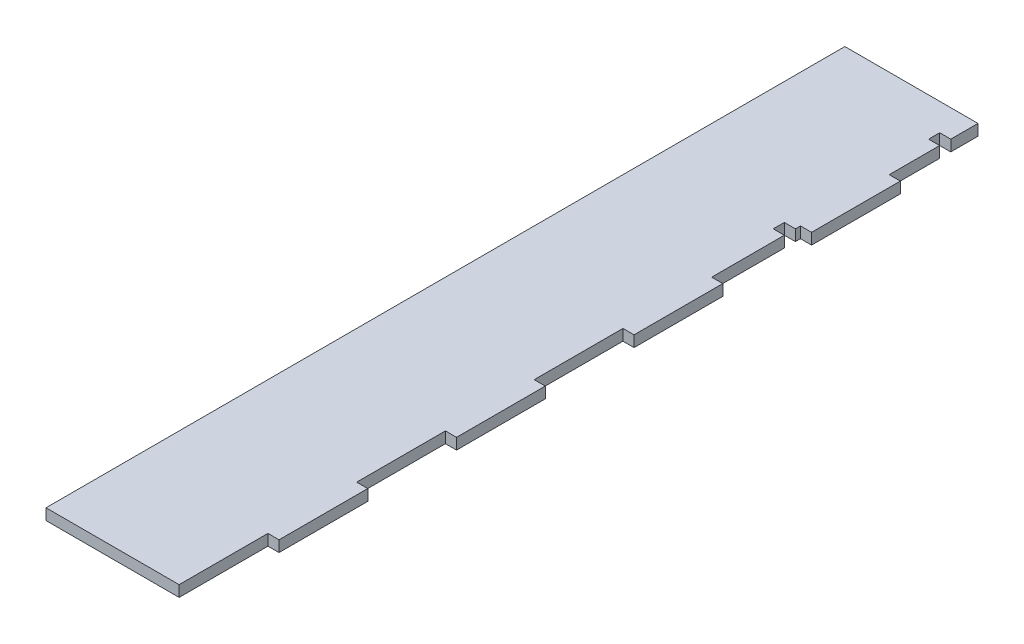
ISO-10303-21;
HEADER;
FILE_DESCRIPTION(('STEP AP214'),'2;1');
FILE_NAME('part.step','',(''),(''),'','','');
FILE_SCHEMA(('AUTOMOTIVE_DESIGN { 1 0 10303 214 1 1 1 1 }'));
ENDSEC;
DATA;
#1=APPLICATION_CONTEXT('core data for automotive mechanical design processes');
#2=APPLICATION_PROTOCOL_DEFINITION('international standard','automotive_design',2000,#1);
#3=PRODUCT_CONTEXT('',#1,'mechanical');
#4=PRODUCT('Part','Part','',(#3));
#5=PRODUCT_RELATED_PRODUCT_CATEGORY('part','',(#4));
#6=PRODUCT_DEFINITION_FORMATION('','',#4);
#7=PRODUCT_DEFINITION_CONTEXT('part definition',#1,'design');
#8=PRODUCT_DEFINITION('design','',#6,#7);
#9=PRODUCT_DEFINITION_SHAPE('','',#8);
#10=(LENGTH_UNIT() NAMED_UNIT(*) SI_UNIT(.MILLI.,.METRE.));
#11=(NAMED_UNIT(*) PLANE_ANGLE_UNIT() SI_UNIT($,.RADIAN.));
#12=(NAMED_UNIT(*) SI_UNIT($,.STERADIAN.) SOLID_ANGLE_UNIT());
#13=UNCERTAINTY_MEASURE_WITH_UNIT(LENGTH_MEASURE(1.E-05),#10,'distance_accuracy_value','');
#14=(GEOMETRIC_REPRESENTATION_CONTEXT(3) GLOBAL_UNCERTAINTY_ASSIGNED_CONTEXT((#13)) GLOBAL_UNIT_ASSIGNED_CONTEXT((#10,
#11,#12)) REPRESENTATION_CONTEXT('',''));
#15=CARTESIAN_POINT('',(0.,0.,0.));
#16=DIRECTION('',(0.,0.,1.));
#17=DIRECTION('',(1.,0.,0.));
#18=AXIS2_PLACEMENT_3D('',#15,#16,#17);
#19=CARTESIAN_POINT('',(38.1,-38.1,457.2));
#20=DIRECTION('',(-1.,0.,0.));
#21=DIRECTION('',(0.,0.,1.));
#22=AXIS2_PLACEMENT_3D('',#19,#20,#21);
#23=PLANE('',#22);
#24=DIRECTION('',(0.,0.,-1.));
#25=VECTOR('',#24,1.);
#26=CARTESIAN_POINT('',(38.1,-38.1,457.2));
#27=LINE('',#26,#25);
#28=CARTESIAN_POINT('',(38.1,-38.1,15.5874999999999));
#29=VERTEX_POINT('',#28);
#30=CARTESIAN_POINT('',(38.1,-38.1,0.));
#31=VERTEX_POINT('',#30);
#32=EDGE_CURVE('E247',#29,#31,#27,.T.);
#33=ORIENTED_EDGE('',*,*,#32,.F.);
#34=DIRECTION('',(0.,1.,0.));
#35=VECTOR('',#34,1.);
#36=CARTESIAN_POINT('',(38.1,-44.45005,15.5874999999999));
#37=LINE('',#36,#35);
#38=CARTESIAN_POINT('',(38.1,-44.45,15.5874999999999));
#39=VERTEX_POINT('',#38);
#40=EDGE_CURVE('E239',#39,#29,#37,.T.);
#41=ORIENTED_EDGE('',*,*,#40,.F.);
#42=DIRECTION('',(0.,0.,-1.));
#43=VECTOR('',#42,1.);
#44=CARTESIAN_POINT('',(38.1,-44.45,457.2));
#45=LINE('',#44,#43);
#46=CARTESIAN_POINT('',(38.1,-44.45,0.));
#47=VERTEX_POINT('',#46);
#48=EDGE_CURVE('E37',#39,#47,#45,.T.);
#49=ORIENTED_EDGE('',*,*,#48,.T.);
#50=DIRECTION('',(0.,1.,0.));
#51=VECTOR('',#50,1.);
#52=CARTESIAN_POINT('',(38.1,-38.1,0.));
#53=LINE('',#52,#51);
#54=EDGE_CURVE('E460',#47,#31,#53,.T.);
#55=ORIENTED_EDGE('',*,*,#54,.T.);
#56=EDGE_LOOP('',(#33,#41,#49,#55));
#57=FACE_BOUND('',#56,.T.);
#58=ADVANCED_FACE('F33',(#57),#23,.F.);
#59=CARTESIAN_POINT('',(38.1,-38.1,104.4875));
#60=VERTEX_POINT('',#59);
#61=CARTESIAN_POINT('',(38.1,-38.1,101.6));
#62=VERTEX_POINT('',#61);
#63=EDGE_CURVE('E246',#60,#62,#27,.T.);
#64=ORIENTED_EDGE('',*,*,#63,.F.);
#65=DIRECTION('',(0.,1.,0.));
#66=VECTOR('',#65,1.);
#67=CARTESIAN_POINT('',(38.1,-44.45,104.4875));
#68=LINE('',#67,#66);
#69=CARTESIAN_POINT('',(38.1,-44.45,104.4875));
#70=VERTEX_POINT('',#69);
#71=EDGE_CURVE('E320',#70,#60,#68,.T.);
#72=ORIENTED_EDGE('',*,*,#71,.F.);
#73=CARTESIAN_POINT('',(38.1,-44.45,101.6));
#74=VERTEX_POINT('',#73);
#75=EDGE_CURVE('E277',#70,#74,#45,.T.);
#76=ORIENTED_EDGE('',*,*,#75,.T.);
#77=DIRECTION('',(0.,-1.,0.));
#78=VECTOR('',#77,1.);
#79=CARTESIAN_POINT('',(38.1,-44.45,101.6));
#80=LINE('',#79,#78);
#81=EDGE_CURVE('E340',#62,#74,#80,.T.);
#82=ORIENTED_EDGE('',*,*,#81,.F.);
#83=EDGE_LOOP('',(#64,#72,#76,#82));
#84=FACE_BOUND('',#83,.T.);
#85=ADVANCED_FACE('F495',(#84),#23,.F.);
#86=CARTESIAN_POINT('',(38.1,-44.45,50.8));
#87=VERTEX_POINT('',#86);
#88=CARTESIAN_POINT('',(38.1,-44.45,21.9374999999999));
#89=VERTEX_POINT('',#88);
#90=EDGE_CURVE('E238',#87,#89,#45,.T.);
#91=ORIENTED_EDGE('',*,*,#90,.T.);
#92=DIRECTION('',(0.,1.,0.));
#93=VECTOR('',#92,1.);
#94=CARTESIAN_POINT('',(38.1,-44.45005,21.9374999999999));
#95=LINE('',#94,#93);
#96=CARTESIAN_POINT('',(38.1,-38.1,21.9374999999999));
#97=VERTEX_POINT('',#96);
#98=EDGE_CURVE('E224',#89,#97,#95,.T.);
#99=ORIENTED_EDGE('',*,*,#98,.T.);
#100=CARTESIAN_POINT('',(38.1,-38.1,50.8));
#101=VERTEX_POINT('',#100);
#102=EDGE_CURVE('E236',#101,#97,#27,.T.);
#103=ORIENTED_EDGE('',*,*,#102,.F.);
#104=DIRECTION('',(0.,1.,0.));
#105=VECTOR('',#104,1.);
#106=CARTESIAN_POINT('',(38.1,-44.45,50.8));
#107=LINE('',#106,#105);
#108=EDGE_CURVE('E343',#87,#101,#107,.T.);
#109=ORIENTED_EDGE('',*,*,#108,.F.);
#110=EDGE_LOOP('',(#91,#99,#103,#109));
#111=FACE_BOUND('',#110,.T.);
#112=ADVANCED_FACE('F234',(#111),#23,.F.);
#113=CARTESIAN_POINT('',(38.1,-44.45,152.4));
#114=VERTEX_POINT('',#113);
#115=CARTESIAN_POINT('',(38.1,-44.45,110.8375));
#116=VERTEX_POINT('',#115);
#117=EDGE_CURVE('E255',#114,#116,#45,.T.);
#118=ORIENTED_EDGE('',*,*,#117,.T.);
#119=DIRECTION('',(0.,1.,0.));
#120=VECTOR('',#119,1.);
#121=CARTESIAN_POINT('',(38.1,-44.45,110.8375));
#122=LINE('',#121,#120);
#123=CARTESIAN_POINT('',(38.1,-38.1,110.8375));
#124=VERTEX_POINT('',#123);
#125=EDGE_CURVE('E316',#116,#124,#122,.T.);
#126=ORIENTED_EDGE('',*,*,#125,.T.);
#127=CARTESIAN_POINT('',(38.1,-38.1,152.4));
#128=VERTEX_POINT('',#127);
#129=EDGE_CURVE('E249',#128,#124,#27,.T.);
#130=ORIENTED_EDGE('',*,*,#129,.F.);
#131=DIRECTION('',(0.,1.,0.));
#132=VECTOR('',#131,1.);
#133=CARTESIAN_POINT('',(38.1,-44.45,152.4));
#134=LINE('',#133,#132);
#135=EDGE_CURVE('E314',#114,#128,#134,.T.);
#136=ORIENTED_EDGE('',*,*,#135,.F.);
#137=EDGE_LOOP('',(#118,#126,#130,#136));
#138=FACE_BOUND('',#137,.T.);
#139=ADVANCED_FACE('F313',(#138),#23,.F.);
#140=DIRECTION('',(0.,-1.,0.));
#141=VECTOR('',#140,1.);
#142=CARTESIAN_POINT('',(38.1,-44.45,203.2));
#143=LINE('',#142,#141);
#144=CARTESIAN_POINT('',(38.1,-38.1,203.2));
#145=VERTEX_POINT('',#144);
#146=CARTESIAN_POINT('',(38.1,-44.45,203.2));
#147=VERTEX_POINT('',#146);
#148=EDGE_CURVE('E339',#145,#147,#143,.T.);
#149=ORIENTED_EDGE('',*,*,#148,.F.);
#150=CARTESIAN_POINT('',(38.1,-38.1,254.));
#151=VERTEX_POINT('',#150);
#152=EDGE_CURVE('E272',#151,#145,#27,.T.);
#153=ORIENTED_EDGE('',*,*,#152,.F.);
#154=DIRECTION('',(0.,1.,0.));
#155=VECTOR('',#154,1.);
#156=CARTESIAN_POINT('',(38.1,-44.45,254.));
#157=LINE('',#156,#155);
#158=CARTESIAN_POINT('',(38.1,-44.45,254.));
#159=VERTEX_POINT('',#158);
#160=EDGE_CURVE('E389',#159,#151,#157,.T.);
#161=ORIENTED_EDGE('',*,*,#160,.F.);
#162=EDGE_CURVE('E284',#159,#147,#45,.T.);
#163=ORIENTED_EDGE('',*,*,#162,.T.);
#164=EDGE_LOOP('',(#149,#153,#161,#163));
#165=FACE_BOUND('',#164,.T.);
#166=ADVANCED_FACE('F507',(#165),#23,.F.);
#167=DIRECTION('',(0.,-1.,0.));
#168=VECTOR('',#167,1.);
#169=CARTESIAN_POINT('',(38.1,-44.45,304.8));
#170=LINE('',#169,#168);
#171=CARTESIAN_POINT('',(38.1,-38.1,304.8));
#172=VERTEX_POINT('',#171);
#173=CARTESIAN_POINT('',(38.1,-44.45,304.8));
#174=VERTEX_POINT('',#173);
#175=EDGE_CURVE('E364',#172,#174,#170,.T.);
#176=ORIENTED_EDGE('',*,*,#175,.F.);
#177=CARTESIAN_POINT('',(38.1,-38.1,355.6));
#178=VERTEX_POINT('',#177);
#179=EDGE_CURVE('E264',#178,#172,#27,.T.);
#180=ORIENTED_EDGE('',*,*,#179,.F.);
#181=DIRECTION('',(0.,1.,0.));
#182=VECTOR('',#181,1.);
#183=CARTESIAN_POINT('',(38.1,-44.45,355.6));
#184=LINE('',#183,#182);
#185=CARTESIAN_POINT('',(38.1,-44.45,355.6));
#186=VERTEX_POINT('',#185);
#187=EDGE_CURVE('E420',#186,#178,#184,.T.);
#188=ORIENTED_EDGE('',*,*,#187,.F.);
#189=EDGE_CURVE('E515',#186,#174,#45,.T.);
#190=ORIENTED_EDGE('',*,*,#189,.T.);
#191=EDGE_LOOP('',(#176,#180,#188,#190));
#192=FACE_BOUND('',#191,.T.);
#193=ADVANCED_FACE('F502',(#192),#23,.F.);
#194=DIRECTION('',(0.,-1.,0.));
#195=VECTOR('',#194,1.);
#196=CARTESIAN_POINT('',(38.1,-44.45,406.4));
#197=LINE('',#196,#195);
#198=CARTESIAN_POINT('',(38.1,-38.1,406.4));
#199=VERTEX_POINT('',#198);
#200=CARTESIAN_POINT('',(38.1,-44.45,406.4));
#201=VERTEX_POINT('',#200);
#202=EDGE_CURVE('E386',#199,#201,#197,.T.);
#203=ORIENTED_EDGE('',*,*,#202,.F.);
#204=CARTESIAN_POINT('',(38.1,-38.1,457.2));
#205=VERTEX_POINT('',#204);
#206=EDGE_CURVE('E269',#205,#199,#27,.T.);
#207=ORIENTED_EDGE('',*,*,#206,.F.);
#208=DIRECTION('',(0.,1.,0.));
#209=VECTOR('',#208,1.);
#210=CARTESIAN_POINT('',(38.1,-38.1,457.2));
#211=LINE('',#210,#209);
#212=CARTESIAN_POINT('',(38.1,-44.45,457.2));
#213=VERTEX_POINT('',#212);
#214=EDGE_CURVE('E452',#213,#205,#211,.T.);
#215=ORIENTED_EDGE('',*,*,#214,.F.);
#216=EDGE_CURVE('E43',#213,#201,#45,.T.);
#217=ORIENTED_EDGE('',*,*,#216,.T.);
#218=EDGE_LOOP('',(#203,#207,#215,#217));
#219=FACE_BOUND('',#218,.T.);
#220=ADVANCED_FACE('F478',(#219),#23,.F.);
#221=CARTESIAN_POINT('',(-38.1,-38.1,457.2));
#222=DIRECTION('',(1.,0.,0.));
#223=DIRECTION('',(0.,0.,-1.));
#224=AXIS2_PLACEMENT_3D('',#221,#222,#223);
#225=PLANE('',#224);
#226=DIRECTION('',(0.,-1.,0.));
#227=VECTOR('',#226,1.);
#228=CARTESIAN_POINT('',(-38.1,-38.1,0.));
#229=LINE('',#228,#227);
#230=CARTESIAN_POINT('',(-38.1,-38.1,0.));
#231=VERTEX_POINT('',#230);
#232=CARTESIAN_POINT('',(-38.1,-44.45,0.));
#233=VERTEX_POINT('',#232);
#234=EDGE_CURVE('E411',#231,#233,#229,.T.);
#235=ORIENTED_EDGE('',*,*,#234,.T.);
#236=DIRECTION('',(0.,0.,-1.));
#237=VECTOR('',#236,1.);
#238=CARTESIAN_POINT('',(-38.1,-44.45,457.2));
#239=LINE('',#238,#237);
#240=CARTESIAN_POINT('',(-38.1,-44.45,457.2));
#241=VERTEX_POINT('',#240);
#242=EDGE_CURVE('E11',#241,#233,#239,.T.);
#243=ORIENTED_EDGE('',*,*,#242,.F.);
#244=DIRECTION('',(0.,-1.,0.));
#245=VECTOR('',#244,1.);
#246=CARTESIAN_POINT('',(-38.1,-38.1,457.2));
#247=LINE('',#246,#245);
#248=CARTESIAN_POINT('',(-38.1,-38.1,457.2));
#249=VERTEX_POINT('',#248);
#250=EDGE_CURVE('E446',#249,#241,#247,.T.);
#251=ORIENTED_EDGE('',*,*,#250,.F.);
#252=DIRECTION('',(0.,0.,-1.));
#253=VECTOR('',#252,1.);
#254=CARTESIAN_POINT('',(-38.1,-38.1,457.2));
#255=LINE('',#254,#253);
#256=EDGE_CURVE('E251',#249,#231,#255,.T.);
#257=ORIENTED_EDGE('',*,*,#256,.T.);
#258=EDGE_LOOP('',(#235,#243,#251,#257));
#259=FACE_BOUND('',#258,.T.);
#260=ADVANCED_FACE('F35',(#259),#225,.F.);
#261=CARTESIAN_POINT('',(-38.1,-44.45,457.2));
#262=DIRECTION('',(0.,1.,0.));
#263=DIRECTION('',(0.,0.,1.));
#264=AXIS2_PLACEMENT_3D('',#261,#262,#263);
#265=PLANE('',#264);
#266=ORIENTED_EDGE('',*,*,#48,.F.);
#267=DIRECTION('',(-1.,0.,0.));
#268=VECTOR('',#267,1.);
#269=CARTESIAN_POINT('',(-38.1,-44.45,15.5874999999999));
#270=LINE('',#269,#268);
#271=CARTESIAN_POINT('',(31.75,-44.45,15.5874999999999));
#272=VERTEX_POINT('',#271);
#273=EDGE_CURVE('E570',#39,#272,#270,.T.);
#274=ORIENTED_EDGE('',*,*,#273,.T.);
#275=DIRECTION('',(0.,0.,1.));
#276=VECTOR('',#275,1.);
#277=CARTESIAN_POINT('',(31.75,-44.45,457.2));
#278=LINE('',#277,#276);
#279=CARTESIAN_POINT('',(31.75,-44.45,21.9374999999999));
#280=VERTEX_POINT('',#279);
#281=EDGE_CURVE('E550',#272,#280,#278,.T.);
#282=ORIENTED_EDGE('',*,*,#281,.T.);
#283=DIRECTION('',(1.,0.,0.));
#284=VECTOR('',#283,1.);
#285=CARTESIAN_POINT('',(-38.1,-44.45,21.9374999999999));
#286=LINE('',#285,#284);
#287=EDGE_CURVE('E568',#280,#89,#286,.T.);
#288=ORIENTED_EDGE('',*,*,#287,.T.);
#289=ORIENTED_EDGE('',*,*,#90,.F.);
#290=DIRECTION('',(-1.,0.,0.));
#291=VECTOR('',#290,1.);
#292=CARTESIAN_POINT('',(95.6453367016958,-44.45,50.8));
#293=LINE('',#292,#291);
#294=CARTESIAN_POINT('',(44.45,-44.45,50.8));
#295=VERTEX_POINT('',#294);
#296=EDGE_CURVE('E349',#295,#87,#293,.T.);
#297=ORIENTED_EDGE('',*,*,#296,.F.);
#298=DIRECTION('',(0.,0.,1.));
#299=VECTOR('',#298,1.);
#300=CARTESIAN_POINT('',(44.45,-44.45,101.6));
#301=LINE('',#300,#299);
#302=CARTESIAN_POINT('',(44.45,-44.45,101.6));
#303=VERTEX_POINT('',#302);
#304=EDGE_CURVE('E332',#295,#303,#301,.T.);
#305=ORIENTED_EDGE('',*,*,#304,.T.);
#306=DIRECTION('',(-1.,0.,0.));
#307=VECTOR('',#306,1.);
#308=CARTESIAN_POINT('',(95.6453367016958,-44.45,101.6));
#309=LINE('',#308,#307);
#310=EDGE_CURVE('E351',#303,#74,#309,.T.);
#311=ORIENTED_EDGE('',*,*,#310,.T.);
#312=ORIENTED_EDGE('',*,*,#75,.F.);
#313=DIRECTION('',(-1.,0.,0.));
#314=VECTOR('',#313,1.);
#315=CARTESIAN_POINT('',(31.75,-44.45,104.4875));
#316=LINE('',#315,#314);
#317=CARTESIAN_POINT('',(31.75,-44.45,104.4875));
#318=VERTEX_POINT('',#317);
#319=EDGE_CURVE('E325',#70,#318,#316,.T.);
#320=ORIENTED_EDGE('',*,*,#319,.T.);
#321=DIRECTION('',(0.,0.,1.));
#322=VECTOR('',#321,1.);
#323=CARTESIAN_POINT('',(31.75,-44.45,104.4875));
#324=LINE('',#323,#322);
#325=CARTESIAN_POINT('',(31.75,-44.45,110.8375));
#326=VERTEX_POINT('',#325);
#327=EDGE_CURVE('E542',#318,#326,#324,.T.);
#328=ORIENTED_EDGE('',*,*,#327,.T.);
#329=DIRECTION('',(1.,0.,0.));
#330=VECTOR('',#329,1.);
#331=CARTESIAN_POINT('',(31.75,-44.45,110.8375));
#332=LINE('',#331,#330);
#333=EDGE_CURVE('E539',#326,#116,#332,.T.);
#334=ORIENTED_EDGE('',*,*,#333,.T.);
#335=ORIENTED_EDGE('',*,*,#117,.F.);
#336=DIRECTION('',(-1.,0.,0.));
#337=VECTOR('',#336,1.);
#338=CARTESIAN_POINT('',(95.6453367016958,-44.45,152.4));
#339=LINE('',#338,#337);
#340=CARTESIAN_POINT('',(44.45,-44.45,152.4));
#341=VERTEX_POINT('',#340);
#342=EDGE_CURVE('E371',#341,#114,#339,.T.);
#343=ORIENTED_EDGE('',*,*,#342,.F.);
#344=DIRECTION('',(0.,0.,1.));
#345=VECTOR('',#344,1.);
#346=CARTESIAN_POINT('',(44.45,-44.45,203.2));
#347=LINE('',#346,#345);
#348=CARTESIAN_POINT('',(44.45,-44.45,203.2));
#349=VERTEX_POINT('',#348);
#350=EDGE_CURVE('E357',#341,#349,#347,.T.);
#351=ORIENTED_EDGE('',*,*,#350,.T.);
#352=DIRECTION('',(-1.,0.,0.));
#353=VECTOR('',#352,1.);
#354=CARTESIAN_POINT('',(95.6453367016958,-44.45,203.2));
#355=LINE('',#354,#353);
#356=EDGE_CURVE('E373',#349,#147,#355,.T.);
#357=ORIENTED_EDGE('',*,*,#356,.T.);
#358=ORIENTED_EDGE('',*,*,#162,.F.);
#359=DIRECTION('',(-1.,0.,0.));
#360=VECTOR('',#359,1.);
#361=CARTESIAN_POINT('',(95.6453367016958,-44.45,254.));
#362=LINE('',#361,#360);
#363=CARTESIAN_POINT('',(44.45,-44.45,254.));
#364=VERTEX_POINT('',#363);
#365=EDGE_CURVE('E395',#364,#159,#362,.T.);
#366=ORIENTED_EDGE('',*,*,#365,.F.);
#367=DIRECTION('',(0.,0.,1.));
#368=VECTOR('',#367,1.);
#369=CARTESIAN_POINT('',(44.45,-44.45,304.8));
#370=LINE('',#369,#368);
#371=CARTESIAN_POINT('',(44.45,-44.45,304.8));
#372=VERTEX_POINT('',#371);
#373=EDGE_CURVE('E379',#364,#372,#370,.T.);
#374=ORIENTED_EDGE('',*,*,#373,.T.);
#375=DIRECTION('',(-1.,0.,0.));
#376=VECTOR('',#375,1.);
#377=CARTESIAN_POINT('',(95.6453367016958,-44.45,304.8));
#378=LINE('',#377,#376);
#379=EDGE_CURVE('E397',#372,#174,#378,.T.);
#380=ORIENTED_EDGE('',*,*,#379,.T.);
#381=ORIENTED_EDGE('',*,*,#189,.F.);
#382=DIRECTION('',(-1.,0.,0.));
#383=VECTOR('',#382,1.);
#384=CARTESIAN_POINT('',(95.6453367016958,-44.45,355.6));
#385=LINE('',#384,#383);
#386=CARTESIAN_POINT('',(44.45,-44.45,355.6));
#387=VERTEX_POINT('',#386);
#388=EDGE_CURVE('E427',#387,#186,#385,.T.);
#389=ORIENTED_EDGE('',*,*,#388,.F.);
#390=DIRECTION('',(0.,0.,1.));
#391=VECTOR('',#390,1.);
#392=CARTESIAN_POINT('',(44.45,-44.45,406.4));
#393=LINE('',#392,#391);
#394=CARTESIAN_POINT('',(44.45,-44.45,406.4));
#395=VERTEX_POINT('',#394);
#396=EDGE_CURVE('E404',#387,#395,#393,.T.);
#397=ORIENTED_EDGE('',*,*,#396,.T.);
#398=DIRECTION('',(-1.,0.,0.));
#399=VECTOR('',#398,1.);
#400=CARTESIAN_POINT('',(95.6453367016958,-44.45,406.4));
#401=LINE('',#400,#399);
#402=EDGE_CURVE('E438',#395,#201,#401,.T.);
#403=ORIENTED_EDGE('',*,*,#402,.T.);
#404=ORIENTED_EDGE('',*,*,#216,.F.);
#405=DIRECTION('',(1.,0.,0.));
#406=VECTOR('',#405,1.);
#407=CARTESIAN_POINT('',(-38.1,-44.45,457.2));
#408=LINE('',#407,#406);
#409=EDGE_CURVE('E449',#241,#213,#408,.T.);
#410=ORIENTED_EDGE('',*,*,#409,.F.);
#411=ORIENTED_EDGE('',*,*,#242,.T.);
#412=DIRECTION('',(1.,0.,0.));
#413=VECTOR('',#412,1.);
#414=CARTESIAN_POINT('',(-38.1,-44.45,0.));
#415=LINE('',#414,#413);
#416=EDGE_CURVE('E458',#233,#47,#415,.T.);
#417=ORIENTED_EDGE('',*,*,#416,.T.);
#418=EDGE_LOOP('',(#266,#274,#282,#288,#289,#297,#305,#311,#312,#320,#328,#334,#335,#343,#351,
#357,#358,#366,#374,#380,#381,#389,#397,#403,#404,#410,#411,#417));
#419=FACE_BOUND('',#418,.T.);
#420=ADVANCED_FACE('F473',(#419),#265,.F.);
#421=CARTESIAN_POINT('',(-38.1,-38.1,457.2));
#422=DIRECTION('',(0.,-1.,0.));
#423=DIRECTION('',(0.,0.,-1.));
#424=AXIS2_PLACEMENT_3D('',#421,#422,#423);
#425=PLANE('',#424);
#426=DIRECTION('',(0.,0.,1.));
#427=VECTOR('',#426,1.);
#428=CARTESIAN_POINT('',(31.75,-38.1,21.9374999999999));
#429=LINE('',#428,#427);
#430=CARTESIAN_POINT('',(31.75,-38.1,15.5874999999999));
#431=VERTEX_POINT('',#430);
#432=CARTESIAN_POINT('',(31.75,-38.1,21.9374999999999));
#433=VERTEX_POINT('',#432);
#434=EDGE_CURVE('E51',#431,#433,#429,.T.);
#435=ORIENTED_EDGE('',*,*,#434,.F.);
#436=DIRECTION('',(-1.,0.,0.));
#437=VECTOR('',#436,1.);
#438=CARTESIAN_POINT('',(31.75,-38.1,15.5874999999999));
#439=LINE('',#438,#437);
#440=EDGE_CURVE('E229',#29,#431,#439,.T.);
#441=ORIENTED_EDGE('',*,*,#440,.F.);
#442=ORIENTED_EDGE('',*,*,#32,.T.);
#443=DIRECTION('',(-1.,0.,0.));
#444=VECTOR('',#443,1.);
#445=CARTESIAN_POINT('',(-38.1,-38.1,0.));
#446=LINE('',#445,#444);
#447=EDGE_CURVE('E450',#31,#231,#446,.T.);
#448=ORIENTED_EDGE('',*,*,#447,.T.);
#449=ORIENTED_EDGE('',*,*,#256,.F.);
#450=DIRECTION('',(-1.,0.,0.));
#451=VECTOR('',#450,1.);
#452=CARTESIAN_POINT('',(-38.1,-38.1,457.2));
#453=LINE('',#452,#451);
#454=EDGE_CURVE('E454',#205,#249,#453,.T.);
#455=ORIENTED_EDGE('',*,*,#454,.F.);
#456=ORIENTED_EDGE('',*,*,#206,.T.);
#457=DIRECTION('',(-1.,0.,0.));
#458=VECTOR('',#457,1.);
#459=CARTESIAN_POINT('',(95.6453367016958,-38.1,406.4));
#460=LINE('',#459,#458);
#461=CARTESIAN_POINT('',(44.45,-38.1,406.4));
#462=VERTEX_POINT('',#461);
#463=EDGE_CURVE('E423',#462,#199,#460,.T.);
#464=ORIENTED_EDGE('',*,*,#463,.F.);
#465=DIRECTION('',(0.,0.,-1.));
#466=VECTOR('',#465,1.);
#467=CARTESIAN_POINT('',(44.45,-38.1,406.4));
#468=LINE('',#467,#466);
#469=CARTESIAN_POINT('',(44.45,-38.1,355.6));
#470=VERTEX_POINT('',#469);
#471=EDGE_CURVE('E405',#462,#470,#468,.T.);
#472=ORIENTED_EDGE('',*,*,#471,.T.);
#473=DIRECTION('',(-1.,0.,0.));
#474=VECTOR('',#473,1.);
#475=CARTESIAN_POINT('',(95.6453367016958,-38.1,355.6));
#476=LINE('',#475,#474);
#477=EDGE_CURVE('E424',#470,#178,#476,.T.);
#478=ORIENTED_EDGE('',*,*,#477,.T.);
#479=ORIENTED_EDGE('',*,*,#179,.T.);
#480=DIRECTION('',(-1.,0.,0.));
#481=VECTOR('',#480,1.);
#482=CARTESIAN_POINT('',(95.6453367016958,-38.1,304.8));
#483=LINE('',#482,#481);
#484=CARTESIAN_POINT('',(44.45,-38.1,304.8));
#485=VERTEX_POINT('',#484);
#486=EDGE_CURVE('E391',#485,#172,#483,.T.);
#487=ORIENTED_EDGE('',*,*,#486,.F.);
#488=DIRECTION('',(0.,0.,-1.));
#489=VECTOR('',#488,1.);
#490=CARTESIAN_POINT('',(44.45,-38.1,304.8));
#491=LINE('',#490,#489);
#492=CARTESIAN_POINT('',(44.45,-38.1,254.));
#493=VERTEX_POINT('',#492);
#494=EDGE_CURVE('E380',#485,#493,#491,.T.);
#495=ORIENTED_EDGE('',*,*,#494,.T.);
#496=DIRECTION('',(-1.,0.,0.));
#497=VECTOR('',#496,1.);
#498=CARTESIAN_POINT('',(95.6453367016958,-38.1,254.));
#499=LINE('',#498,#497);
#500=EDGE_CURVE('E393',#493,#151,#499,.T.);
#501=ORIENTED_EDGE('',*,*,#500,.T.);
#502=ORIENTED_EDGE('',*,*,#152,.T.);
#503=DIRECTION('',(-1.,0.,0.));
#504=VECTOR('',#503,1.);
#505=CARTESIAN_POINT('',(95.6453367016958,-38.1,203.2));
#506=LINE('',#505,#504);
#507=CARTESIAN_POINT('',(44.45,-38.1,203.2));
#508=VERTEX_POINT('',#507);
#509=EDGE_CURVE('E368',#508,#145,#506,.T.);
#510=ORIENTED_EDGE('',*,*,#509,.F.);
#511=DIRECTION('',(0.,0.,-1.));
#512=VECTOR('',#511,1.);
#513=CARTESIAN_POINT('',(44.45,-38.1,203.2));
#514=LINE('',#513,#512);
#515=CARTESIAN_POINT('',(44.45,-38.1,152.4));
#516=VERTEX_POINT('',#515);
#517=EDGE_CURVE('E358',#508,#516,#514,.T.);
#518=ORIENTED_EDGE('',*,*,#517,.T.);
#519=DIRECTION('',(-1.,0.,0.));
#520=VECTOR('',#519,1.);
#521=CARTESIAN_POINT('',(95.6453367016958,-38.1,152.4));
#522=LINE('',#521,#520);
#523=EDGE_CURVE('E309',#516,#128,#522,.T.);
#524=ORIENTED_EDGE('',*,*,#523,.T.);
#525=ORIENTED_EDGE('',*,*,#129,.T.);
#526=DIRECTION('',(1.,0.,0.));
#527=VECTOR('',#526,1.);
#528=CARTESIAN_POINT('',(31.75,-38.1,110.8375));
#529=LINE('',#528,#527);
#530=CARTESIAN_POINT('',(31.75,-38.1,110.8375));
#531=VERTEX_POINT('',#530);
#532=EDGE_CURVE('E306',#531,#124,#529,.T.);
#533=ORIENTED_EDGE('',*,*,#532,.F.);
#534=DIRECTION('',(0.,0.,1.));
#535=VECTOR('',#534,1.);
#536=CARTESIAN_POINT('',(31.75,-38.1,104.4875));
#537=LINE('',#536,#535);
#538=CARTESIAN_POINT('',(31.75,-38.1,104.4875));
#539=VERTEX_POINT('',#538);
#540=EDGE_CURVE('E59',#539,#531,#537,.T.);
#541=ORIENTED_EDGE('',*,*,#540,.F.);
#542=DIRECTION('',(-1.,0.,0.));
#543=VECTOR('',#542,1.);
#544=CARTESIAN_POINT('',(31.75,-38.1,104.4875));
#545=LINE('',#544,#543);
#546=EDGE_CURVE('E545',#60,#539,#545,.T.);
#547=ORIENTED_EDGE('',*,*,#546,.F.);
#548=ORIENTED_EDGE('',*,*,#63,.T.);
#549=DIRECTION('',(-1.,0.,0.));
#550=VECTOR('',#549,1.);
#551=CARTESIAN_POINT('',(95.6453367016958,-38.1,101.6));
#552=LINE('',#551,#550);
#553=CARTESIAN_POINT('',(44.45,-38.1,101.6));
#554=VERTEX_POINT('',#553);
#555=EDGE_CURVE('E345',#554,#62,#552,.T.);
#556=ORIENTED_EDGE('',*,*,#555,.F.);
#557=DIRECTION('',(0.,0.,-1.));
#558=VECTOR('',#557,1.);
#559=CARTESIAN_POINT('',(44.45,-38.1,101.6));
#560=LINE('',#559,#558);
#561=CARTESIAN_POINT('',(44.45,-38.1,50.8));
#562=VERTEX_POINT('',#561);
#563=EDGE_CURVE('E333',#554,#562,#560,.T.);
#564=ORIENTED_EDGE('',*,*,#563,.T.);
#565=DIRECTION('',(-1.,0.,0.));
#566=VECTOR('',#565,1.);
#567=CARTESIAN_POINT('',(95.6453367016958,-38.1,50.8));
#568=LINE('',#567,#566);
#569=EDGE_CURVE('E245',#562,#101,#568,.T.);
#570=ORIENTED_EDGE('',*,*,#569,.T.);
#571=ORIENTED_EDGE('',*,*,#102,.T.);
#572=DIRECTION('',(1.,0.,0.));
#573=VECTOR('',#572,1.);
#574=CARTESIAN_POINT('',(31.75,-38.1,21.9374999999999));
#575=LINE('',#574,#573);
#576=EDGE_CURVE('E221',#433,#97,#575,.T.);
#577=ORIENTED_EDGE('',*,*,#576,.F.);
#578=EDGE_LOOP('',(#435,#441,#442,#448,#449,#455,#456,#464,#472,#478,#479,#487,#495,#501,#502,
#510,#518,#524,#525,#533,#541,#547,#548,#556,#564,#570,#571,#577));
#579=FACE_BOUND('',#578,.T.);
#580=ADVANCED_FACE('F242',(#579),#425,.F.);
#581=CARTESIAN_POINT('',(0.,0.,457.2));
#582=DIRECTION('',(0.,0.,1.));
#583=DIRECTION('',(1.,0.,0.));
#584=AXIS2_PLACEMENT_3D('',#581,#582,#583);
#585=PLANE('',#584);
#586=ORIENTED_EDGE('',*,*,#250,.T.);
#587=ORIENTED_EDGE('',*,*,#409,.T.);
#588=ORIENTED_EDGE('',*,*,#214,.T.);
#589=ORIENTED_EDGE('',*,*,#454,.T.);
#590=EDGE_LOOP('',(#586,#587,#588,#589));
#591=FACE_BOUND('',#590,.T.);
#592=ADVANCED_FACE('F476',(#591),#585,.T.);
#593=CARTESIAN_POINT('',(0.,0.,0.));
#594=DIRECTION('',(0.,0.,1.));
#595=DIRECTION('',(1.,0.,0.));
#596=AXIS2_PLACEMENT_3D('',#593,#594,#595);
#597=PLANE('',#596);
#598=ORIENTED_EDGE('',*,*,#234,.F.);
#599=ORIENTED_EDGE('',*,*,#447,.F.);
#600=ORIENTED_EDGE('',*,*,#54,.F.);
#601=ORIENTED_EDGE('',*,*,#416,.F.);
#602=EDGE_LOOP('',(#598,#599,#600,#601));
#603=FACE_BOUND('',#602,.T.);
#604=ADVANCED_FACE('F472',(#603),#597,.F.);
#605=CARTESIAN_POINT('',(95.6453367016958,-44.45,355.6));
#606=DIRECTION('',(0.,0.,1.));
#607=DIRECTION('',(1.,0.,0.));
#608=AXIS2_PLACEMENT_3D('',#605,#606,#607);
#609=PLANE('',#608);
#610=ORIENTED_EDGE('',*,*,#477,.F.);
#611=DIRECTION('',(0.,-1.,0.));
#612=VECTOR('',#611,1.);
#613=CARTESIAN_POINT('',(44.45,-44.45,355.6));
#614=LINE('',#613,#612);
#615=EDGE_CURVE('E401',#470,#387,#614,.T.);
#616=ORIENTED_EDGE('',*,*,#615,.T.);
#617=ORIENTED_EDGE('',*,*,#388,.T.);
#618=ORIENTED_EDGE('',*,*,#187,.T.);
#619=EDGE_LOOP('',(#610,#616,#617,#618));
#620=FACE_BOUND('',#619,.T.);
#621=ADVANCED_FACE('F484',(#620),#609,.F.);
#622=CARTESIAN_POINT('',(95.6453367016958,-44.45,406.4));
#623=DIRECTION('',(0.,0.,-1.));
#624=DIRECTION('',(-1.,0.,0.));
#625=AXIS2_PLACEMENT_3D('',#622,#623,#624);
#626=PLANE('',#625);
#627=ORIENTED_EDGE('',*,*,#402,.F.);
#628=DIRECTION('',(0.,1.,0.));
#629=VECTOR('',#628,1.);
#630=CARTESIAN_POINT('',(44.45,-44.45,406.4));
#631=LINE('',#630,#629);
#632=EDGE_CURVE('E408',#395,#462,#631,.T.);
#633=ORIENTED_EDGE('',*,*,#632,.T.);
#634=ORIENTED_EDGE('',*,*,#463,.T.);
#635=ORIENTED_EDGE('',*,*,#202,.T.);
#636=EDGE_LOOP('',(#627,#633,#634,#635));
#637=FACE_BOUND('',#636,.T.);
#638=ADVANCED_FACE('F479',(#637),#626,.F.);
#639=CARTESIAN_POINT('',(44.45,-44.45,457.2));
#640=DIRECTION('',(-1.,0.,0.));
#641=DIRECTION('',(0.,-1.,0.));
#642=AXIS2_PLACEMENT_3D('',#639,#640,#641);
#643=PLANE('',#642);
#644=ORIENTED_EDGE('',*,*,#396,.F.);
#645=ORIENTED_EDGE('',*,*,#615,.F.);
#646=ORIENTED_EDGE('',*,*,#471,.F.);
#647=ORIENTED_EDGE('',*,*,#632,.F.);
#648=EDGE_LOOP('',(#644,#645,#646,#647));
#649=FACE_BOUND('',#648,.T.);
#650=ADVANCED_FACE('F483',(#649),#643,.F.);
#651=CARTESIAN_POINT('',(95.6453367016958,-44.45,254.));
#652=DIRECTION('',(0.,0.,1.));
#653=DIRECTION('',(1.,0.,0.));
#654=AXIS2_PLACEMENT_3D('',#651,#652,#653);
#655=PLANE('',#654);
#656=ORIENTED_EDGE('',*,*,#500,.F.);
#657=DIRECTION('',(0.,-1.,0.));
#658=VECTOR('',#657,1.);
#659=CARTESIAN_POINT('',(44.45,-44.45,254.));
#660=LINE('',#659,#658);
#661=EDGE_CURVE('E376',#493,#364,#660,.T.);
#662=ORIENTED_EDGE('',*,*,#661,.T.);
#663=ORIENTED_EDGE('',*,*,#365,.T.);
#664=ORIENTED_EDGE('',*,*,#160,.T.);
#665=EDGE_LOOP('',(#656,#662,#663,#664));
#666=FACE_BOUND('',#665,.T.);
#667=ADVANCED_FACE('F524',(#666),#655,.F.);
#668=CARTESIAN_POINT('',(95.6453367016958,-44.45,304.8));
#669=DIRECTION('',(0.,0.,-1.));
#670=DIRECTION('',(-1.,0.,0.));
#671=AXIS2_PLACEMENT_3D('',#668,#669,#670);
#672=PLANE('',#671);
#673=ORIENTED_EDGE('',*,*,#379,.F.);
#674=DIRECTION('',(0.,1.,0.));
#675=VECTOR('',#674,1.);
#676=CARTESIAN_POINT('',(44.45,-44.45,304.8));
#677=LINE('',#676,#675);
#678=EDGE_CURVE('E383',#372,#485,#677,.T.);
#679=ORIENTED_EDGE('',*,*,#678,.T.);
#680=ORIENTED_EDGE('',*,*,#486,.T.);
#681=ORIENTED_EDGE('',*,*,#175,.T.);
#682=EDGE_LOOP('',(#673,#679,#680,#681));
#683=FACE_BOUND('',#682,.T.);
#684=ADVANCED_FACE('F518',(#683),#672,.F.);
#685=CARTESIAN_POINT('',(44.45,-44.45,457.2));
#686=DIRECTION('',(-1.,0.,0.));
#687=DIRECTION('',(0.,-1.,0.));
#688=AXIS2_PLACEMENT_3D('',#685,#686,#687);
#689=PLANE('',#688);
#690=ORIENTED_EDGE('',*,*,#373,.F.);
#691=ORIENTED_EDGE('',*,*,#661,.F.);
#692=ORIENTED_EDGE('',*,*,#494,.F.);
#693=ORIENTED_EDGE('',*,*,#678,.F.);
#694=EDGE_LOOP('',(#690,#691,#692,#693));
#695=FACE_BOUND('',#694,.T.);
#696=ADVANCED_FACE('F521',(#695),#689,.F.);
#697=CARTESIAN_POINT('',(95.6453367016958,-44.45,152.4));
#698=DIRECTION('',(0.,0.,1.));
#699=DIRECTION('',(1.,0.,0.));
#700=AXIS2_PLACEMENT_3D('',#697,#698,#699);
#701=PLANE('',#700);
#702=ORIENTED_EDGE('',*,*,#523,.F.);
#703=DIRECTION('',(0.,-1.,0.));
#704=VECTOR('',#703,1.);
#705=CARTESIAN_POINT('',(44.45,-44.45,152.4));
#706=LINE('',#705,#704);
#707=EDGE_CURVE('E354',#516,#341,#706,.T.);
#708=ORIENTED_EDGE('',*,*,#707,.T.);
#709=ORIENTED_EDGE('',*,*,#342,.T.);
#710=ORIENTED_EDGE('',*,*,#135,.T.);
#711=EDGE_LOOP('',(#702,#708,#709,#710));
#712=FACE_BOUND('',#711,.T.);
#713=ADVANCED_FACE('F537',(#712),#701,.F.);
#714=CARTESIAN_POINT('',(95.6453367016958,-44.45,203.2));
#715=DIRECTION('',(0.,0.,-1.));
#716=DIRECTION('',(-1.,0.,0.));
#717=AXIS2_PLACEMENT_3D('',#714,#715,#716);
#718=PLANE('',#717);
#719=ORIENTED_EDGE('',*,*,#356,.F.);
#720=DIRECTION('',(0.,1.,0.));
#721=VECTOR('',#720,1.);
#722=CARTESIAN_POINT('',(44.45,-44.45,203.2));
#723=LINE('',#722,#721);
#724=EDGE_CURVE('E361',#349,#508,#723,.T.);
#725=ORIENTED_EDGE('',*,*,#724,.T.);
#726=ORIENTED_EDGE('',*,*,#509,.T.);
#727=ORIENTED_EDGE('',*,*,#148,.T.);
#728=EDGE_LOOP('',(#719,#725,#726,#727));
#729=FACE_BOUND('',#728,.T.);
#730=ADVANCED_FACE('F533',(#729),#718,.F.);
#731=CARTESIAN_POINT('',(44.45,-44.45,457.2));
#732=DIRECTION('',(-1.,0.,0.));
#733=DIRECTION('',(0.,-1.,0.));
#734=AXIS2_PLACEMENT_3D('',#731,#732,#733);
#735=PLANE('',#734);
#736=ORIENTED_EDGE('',*,*,#350,.F.);
#737=ORIENTED_EDGE('',*,*,#707,.F.);
#738=ORIENTED_EDGE('',*,*,#517,.F.);
#739=ORIENTED_EDGE('',*,*,#724,.F.);
#740=EDGE_LOOP('',(#736,#737,#738,#739));
#741=FACE_BOUND('',#740,.T.);
#742=ADVANCED_FACE('F535',(#741),#735,.F.);
#743=CARTESIAN_POINT('',(95.6453367016958,-44.45,50.8));
#744=DIRECTION('',(0.,0.,1.));
#745=DIRECTION('',(0.,-1.,0.));
#746=AXIS2_PLACEMENT_3D('',#743,#744,#745);
#747=PLANE('',#746);
#748=ORIENTED_EDGE('',*,*,#569,.F.);
#749=DIRECTION('',(0.,-1.,0.));
#750=VECTOR('',#749,1.);
#751=CARTESIAN_POINT('',(44.45,-44.45,50.8));
#752=LINE('',#751,#750);
#753=EDGE_CURVE('E329',#562,#295,#752,.T.);
#754=ORIENTED_EDGE('',*,*,#753,.T.);
#755=ORIENTED_EDGE('',*,*,#296,.T.);
#756=ORIENTED_EDGE('',*,*,#108,.T.);
#757=EDGE_LOOP('',(#748,#754,#755,#756));
#758=FACE_BOUND('',#757,.T.);
#759=ADVANCED_FACE('F566',(#758),#747,.F.);
#760=CARTESIAN_POINT('',(95.6453367016958,-44.45,101.6));
#761=DIRECTION('',(0.,0.,-1.));
#762=DIRECTION('',(0.,1.,0.));
#763=AXIS2_PLACEMENT_3D('',#760,#761,#762);
#764=PLANE('',#763);
#765=ORIENTED_EDGE('',*,*,#310,.F.);
#766=DIRECTION('',(0.,1.,0.));
#767=VECTOR('',#766,1.);
#768=CARTESIAN_POINT('',(44.45,-44.45,101.6));
#769=LINE('',#768,#767);
#770=EDGE_CURVE('E336',#303,#554,#769,.T.);
#771=ORIENTED_EDGE('',*,*,#770,.T.);
#772=ORIENTED_EDGE('',*,*,#555,.T.);
#773=ORIENTED_EDGE('',*,*,#81,.T.);
#774=EDGE_LOOP('',(#765,#771,#772,#773));
#775=FACE_BOUND('',#774,.T.);
#776=ADVANCED_FACE('F561',(#775),#764,.F.);
#777=CARTESIAN_POINT('',(44.45,-44.45,457.2));
#778=DIRECTION('',(-1.,0.,0.));
#779=DIRECTION('',(0.,-1.,0.));
#780=AXIS2_PLACEMENT_3D('',#777,#778,#779);
#781=PLANE('',#780);
#782=ORIENTED_EDGE('',*,*,#304,.F.);
#783=ORIENTED_EDGE('',*,*,#753,.F.);
#784=ORIENTED_EDGE('',*,*,#563,.F.);
#785=ORIENTED_EDGE('',*,*,#770,.F.);
#786=EDGE_LOOP('',(#782,#783,#784,#785));
#787=FACE_BOUND('',#786,.T.);
#788=ADVANCED_FACE('F563',(#787),#781,.F.);
#789=CARTESIAN_POINT('',(31.75,-44.45,104.4875));
#790=DIRECTION('',(-1.,0.,0.));
#791=DIRECTION('',(0.,0.,1.));
#792=AXIS2_PLACEMENT_3D('',#789,#790,#791);
#793=PLANE('',#792);
#794=ORIENTED_EDGE('',*,*,#540,.T.);
#795=DIRECTION('',(0.,1.,0.));
#796=VECTOR('',#795,1.);
#797=CARTESIAN_POINT('',(31.75,-44.45,110.8375));
#798=LINE('',#797,#796);
#799=EDGE_CURVE('E321',#326,#531,#798,.T.);
#800=ORIENTED_EDGE('',*,*,#799,.F.);
#801=ORIENTED_EDGE('',*,*,#327,.F.);
#802=DIRECTION('',(0.,1.,0.));
#803=VECTOR('',#802,1.);
#804=CARTESIAN_POINT('',(31.75,-44.45,104.4875));
#805=LINE('',#804,#803);
#806=EDGE_CURVE('E323',#318,#539,#805,.T.);
#807=ORIENTED_EDGE('',*,*,#806,.T.);
#808=EDGE_LOOP('',(#794,#800,#801,#807));
#809=FACE_BOUND('',#808,.T.);
#810=ADVANCED_FACE('F553',(#809),#793,.F.);
#811=CARTESIAN_POINT('',(31.75,-44.45,104.4875));
#812=DIRECTION('',(0.,0.,-1.));
#813=DIRECTION('',(-1.,0.,0.));
#814=AXIS2_PLACEMENT_3D('',#811,#812,#813);
#815=PLANE('',#814);
#816=ORIENTED_EDGE('',*,*,#546,.T.);
#817=ORIENTED_EDGE('',*,*,#806,.F.);
#818=ORIENTED_EDGE('',*,*,#319,.F.);
#819=ORIENTED_EDGE('',*,*,#71,.T.);
#820=EDGE_LOOP('',(#816,#817,#818,#819));
#821=FACE_BOUND('',#820,.T.);
#822=ADVANCED_FACE('F556',(#821),#815,.F.);
#823=CARTESIAN_POINT('',(31.75,-44.45,110.8375));
#824=DIRECTION('',(0.,0.,1.));
#825=DIRECTION('',(1.,0.,0.));
#826=AXIS2_PLACEMENT_3D('',#823,#824,#825);
#827=PLANE('',#826);
#828=ORIENTED_EDGE('',*,*,#532,.T.);
#829=ORIENTED_EDGE('',*,*,#125,.F.);
#830=ORIENTED_EDGE('',*,*,#333,.F.);
#831=ORIENTED_EDGE('',*,*,#799,.T.);
#832=EDGE_LOOP('',(#828,#829,#830,#831));
#833=FACE_BOUND('',#832,.T.);
#834=ADVANCED_FACE('F585',(#833),#827,.F.);
#835=CARTESIAN_POINT('',(31.75,-44.45005,21.9374999999999));
#836=DIRECTION('',(-1.,0.,0.));
#837=DIRECTION('',(0.,0.,1.));
#838=AXIS2_PLACEMENT_3D('',#835,#836,#837);
#839=PLANE('',#838);
#840=DIRECTION('',(0.,1.,0.));
#841=VECTOR('',#840,1.);
#842=CARTESIAN_POINT('',(31.75,-44.45005,15.5874999999999));
#843=LINE('',#842,#841);
#844=EDGE_CURVE('E571',#272,#431,#843,.T.);
#845=ORIENTED_EDGE('',*,*,#844,.T.);
#846=ORIENTED_EDGE('',*,*,#434,.T.);
#847=DIRECTION('',(0.,1.,0.));
#848=VECTOR('',#847,1.);
#849=CARTESIAN_POINT('',(31.75,-44.45005,21.9374999999999));
#850=LINE('',#849,#848);
#851=EDGE_CURVE('E226',#280,#433,#850,.T.);
#852=ORIENTED_EDGE('',*,*,#851,.F.);
#853=ORIENTED_EDGE('',*,*,#281,.F.);
#854=EDGE_LOOP('',(#845,#846,#852,#853));
#855=FACE_BOUND('',#854,.T.);
#856=ADVANCED_FACE('F583',(#855),#839,.F.);
#857=CARTESIAN_POINT('',(31.75,-44.45005,15.5874999999999));
#858=DIRECTION('',(0.,0.,-1.));
#859=DIRECTION('',(-1.,0.,0.));
#860=AXIS2_PLACEMENT_3D('',#857,#858,#859);
#861=PLANE('',#860);
#862=ORIENTED_EDGE('',*,*,#40,.T.);
#863=ORIENTED_EDGE('',*,*,#440,.T.);
#864=ORIENTED_EDGE('',*,*,#844,.F.);
#865=ORIENTED_EDGE('',*,*,#273,.F.);
#866=EDGE_LOOP('',(#862,#863,#864,#865));
#867=FACE_BOUND('',#866,.T.);
#868=ADVANCED_FACE('F582',(#867),#861,.F.);
#869=CARTESIAN_POINT('',(31.75,-44.45005,21.9374999999999));
#870=DIRECTION('',(0.,0.,1.));
#871=DIRECTION('',(1.,0.,0.));
#872=AXIS2_PLACEMENT_3D('',#869,#870,#871);
#873=PLANE('',#872);
#874=ORIENTED_EDGE('',*,*,#851,.T.);
#875=ORIENTED_EDGE('',*,*,#576,.T.);
#876=ORIENTED_EDGE('',*,*,#98,.F.);
#877=ORIENTED_EDGE('',*,*,#287,.F.);
#878=EDGE_LOOP('',(#874,#875,#876,#877));
#879=FACE_BOUND('',#878,.T.);
#880=ADVANCED_FACE('F223',(#879),#873,.F.);
#881=CLOSED_SHELL('',(#58,#85,#112,#139,#166,#193,#220,#260,#420,#580,#592,#604,#621,#638,#650,
#667,#684,#696,#713,#730,#742,#759,#776,#788,#810,#822,#834,#856,#868,#880));
#882=MANIFOLD_SOLID_BREP('B2',#881);
#883=ADVANCED_BREP_SHAPE_REPRESENTATION('',(#18,#882),#14);
#884=SHAPE_DEFINITION_REPRESENTATION(#9,#883);
ENDSEC;
END-ISO-10303-21;
